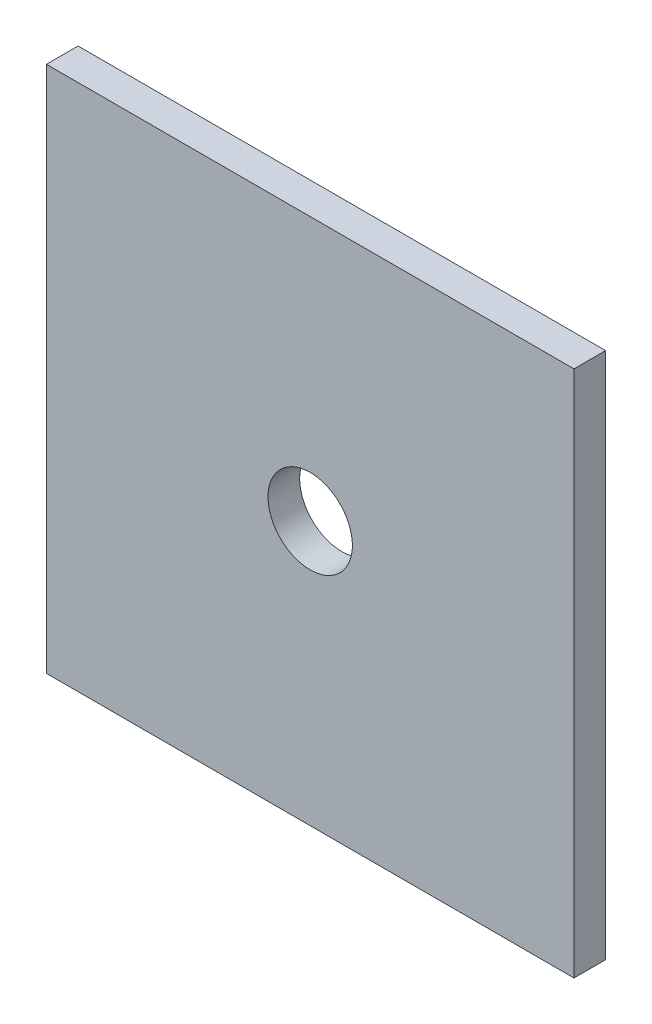
ISO-10303-21;
HEADER;
FILE_DESCRIPTION(('STEP AP214'),'2;1');
FILE_NAME('part.step','',(''),(''),'','','');
FILE_SCHEMA(('AUTOMOTIVE_DESIGN { 1 0 10303 214 1 1 1 1 }'));
ENDSEC;
DATA;
#1=APPLICATION_CONTEXT('core data for automotive mechanical design processes');
#2=APPLICATION_PROTOCOL_DEFINITION('international standard','automotive_design',2000,#1);
#3=PRODUCT_CONTEXT('',#1,'mechanical');
#4=PRODUCT('Part','Part','',(#3));
#5=PRODUCT_RELATED_PRODUCT_CATEGORY('part','',(#4));
#6=PRODUCT_DEFINITION_FORMATION('','',#4);
#7=PRODUCT_DEFINITION_CONTEXT('part definition',#1,'design');
#8=PRODUCT_DEFINITION('design','',#6,#7);
#9=PRODUCT_DEFINITION_SHAPE('','',#8);
#10=(LENGTH_UNIT() NAMED_UNIT(*) SI_UNIT(.MILLI.,.METRE.));
#11=(NAMED_UNIT(*) PLANE_ANGLE_UNIT() SI_UNIT($,.RADIAN.));
#12=(NAMED_UNIT(*) SI_UNIT($,.STERADIAN.) SOLID_ANGLE_UNIT());
#13=UNCERTAINTY_MEASURE_WITH_UNIT(LENGTH_MEASURE(1.E-05),#10,'distance_accuracy_value','');
#14=(GEOMETRIC_REPRESENTATION_CONTEXT(3) GLOBAL_UNCERTAINTY_ASSIGNED_CONTEXT((#13)) GLOBAL_UNIT_ASSIGNED_CONTEXT((#10,
#11,#12)) REPRESENTATION_CONTEXT('',''));
#15=CARTESIAN_POINT('',(0.,0.,0.));
#16=DIRECTION('',(0.,0.,1.));
#17=DIRECTION('',(1.,0.,0.));
#18=AXIS2_PLACEMENT_3D('',#15,#16,#17);
#19=CARTESIAN_POINT('',(0.,0.,0.));
#20=DIRECTION('',(0.,0.,-1.));
#21=DIRECTION('',(-1.,0.,0.));
#22=AXIS2_PLACEMENT_3D('',#19,#20,#21);
#23=PLANE('',#22);
#24=CARTESIAN_POINT('',(0.,0.,0.));
#25=DIRECTION('',(0.,0.,-1.));
#26=DIRECTION('',(-1.,0.,0.));
#27=AXIS2_PLACEMENT_3D('',#24,#25,#26);
#28=CIRCLE('',#27,4.);
#29=CARTESIAN_POINT('',(-4.,0.,0.));
#30=VERTEX_POINT('',#29);
#31=EDGE_CURVE('E20',#30,#30,#28,.F.);
#32=ORIENTED_EDGE('',*,*,#31,.T.);
#33=EDGE_LOOP('',(#32));
#34=FACE_BOUND('',#33,.T.);
#35=DIRECTION('',(0.,1.,0.));
#36=VECTOR('',#35,1.);
#37=CARTESIAN_POINT('',(-25.,-25.,0.));
#38=LINE('',#37,#36);
#39=CARTESIAN_POINT('',(-25.,-25.,0.));
#40=VERTEX_POINT('',#39);
#41=CARTESIAN_POINT('',(-25.,25.,0.));
#42=VERTEX_POINT('',#41);
#43=EDGE_CURVE('E55',#40,#42,#38,.T.);
#44=ORIENTED_EDGE('',*,*,#43,.T.);
#45=DIRECTION('',(1.,0.,0.));
#46=VECTOR('',#45,1.);
#47=CARTESIAN_POINT('',(-25.,25.,0.));
#48=LINE('',#47,#46);
#49=CARTESIAN_POINT('',(25.,25.,0.));
#50=VERTEX_POINT('',#49);
#51=EDGE_CURVE('E79',#42,#50,#48,.T.);
#52=ORIENTED_EDGE('',*,*,#51,.T.);
#53=DIRECTION('',(0.,1.,0.));
#54=VECTOR('',#53,1.);
#55=CARTESIAN_POINT('',(25.,-25.,0.));
#56=LINE('',#55,#54);
#57=CARTESIAN_POINT('',(25.,-25.,0.));
#58=VERTEX_POINT('',#57);
#59=EDGE_CURVE('E59',#50,#58,#56,.F.);
#60=ORIENTED_EDGE('',*,*,#59,.T.);
#61=DIRECTION('',(1.,0.,0.));
#62=VECTOR('',#61,1.);
#63=CARTESIAN_POINT('',(-25.,-25.,0.));
#64=LINE('',#63,#62);
#65=EDGE_CURVE('E58',#58,#40,#64,.F.);
#66=ORIENTED_EDGE('',*,*,#65,.T.);
#67=EDGE_LOOP('',(#44,#52,#60,#66));
#68=FACE_BOUND('',#67,.T.);
#69=ADVANCED_FACE('F17',(#34,#68),#23,.T.);
#70=CARTESIAN_POINT('',(-25.,-25.,3.));
#71=DIRECTION('',(0.,1.,0.));
#72=DIRECTION('',(0.,0.,1.));
#73=AXIS2_PLACEMENT_3D('',#70,#71,#72);
#74=PLANE('',#73);
#75=DIRECTION('',(0.,0.,1.));
#76=VECTOR('',#75,1.);
#77=CARTESIAN_POINT('',(25.,-25.,3.));
#78=LINE('',#77,#76);
#79=CARTESIAN_POINT('',(25.,-25.,3.));
#80=VERTEX_POINT('',#79);
#81=EDGE_CURVE('E81',#58,#80,#78,.T.);
#82=ORIENTED_EDGE('',*,*,#81,.T.);
#83=DIRECTION('',(-1.,0.,0.));
#84=VECTOR('',#83,1.);
#85=CARTESIAN_POINT('',(0.,-25.,3.));
#86=LINE('',#85,#84);
#87=CARTESIAN_POINT('',(-25.,-25.,3.));
#88=VERTEX_POINT('',#87);
#89=EDGE_CURVE('E75',#80,#88,#86,.T.);
#90=ORIENTED_EDGE('',*,*,#89,.T.);
#91=DIRECTION('',(0.,0.,-1.));
#92=VECTOR('',#91,1.);
#93=CARTESIAN_POINT('',(-25.,-25.,3.));
#94=LINE('',#93,#92);
#95=EDGE_CURVE('E64',#88,#40,#94,.T.);
#96=ORIENTED_EDGE('',*,*,#95,.T.);
#97=ORIENTED_EDGE('',*,*,#65,.F.);
#98=EDGE_LOOP('',(#82,#90,#96,#97));
#99=FACE_BOUND('',#98,.T.);
#100=ADVANCED_FACE('F74',(#99),#74,.F.);
#101=CARTESIAN_POINT('',(-25.,-25.,3.));
#102=DIRECTION('',(1.,0.,0.));
#103=DIRECTION('',(0.,0.,-1.));
#104=AXIS2_PLACEMENT_3D('',#101,#102,#103);
#105=PLANE('',#104);
#106=ORIENTED_EDGE('',*,*,#95,.F.);
#107=DIRECTION('',(0.,1.,0.));
#108=VECTOR('',#107,1.);
#109=CARTESIAN_POINT('',(-25.,0.,3.));
#110=LINE('',#109,#108);
#111=CARTESIAN_POINT('',(-25.,25.,3.));
#112=VERTEX_POINT('',#111);
#113=EDGE_CURVE('E86',#88,#112,#110,.T.);
#114=ORIENTED_EDGE('',*,*,#113,.T.);
#115=DIRECTION('',(0.,0.,-1.));
#116=VECTOR('',#115,1.);
#117=CARTESIAN_POINT('',(-25.,25.,3.));
#118=LINE('',#117,#116);
#119=EDGE_CURVE('E71',#112,#42,#118,.T.);
#120=ORIENTED_EDGE('',*,*,#119,.T.);
#121=ORIENTED_EDGE('',*,*,#43,.F.);
#122=EDGE_LOOP('',(#106,#114,#120,#121));
#123=FACE_BOUND('',#122,.T.);
#124=ADVANCED_FACE('F68',(#123),#105,.F.);
#125=CARTESIAN_POINT('',(-25.,25.,3.));
#126=DIRECTION('',(0.,-1.,0.));
#127=DIRECTION('',(0.,0.,-1.));
#128=AXIS2_PLACEMENT_3D('',#125,#126,#127);
#129=PLANE('',#128);
#130=ORIENTED_EDGE('',*,*,#119,.F.);
#131=DIRECTION('',(-1.,0.,0.));
#132=VECTOR('',#131,1.);
#133=CARTESIAN_POINT('',(0.,25.,3.));
#134=LINE('',#133,#132);
#135=CARTESIAN_POINT('',(25.,25.,3.));
#136=VERTEX_POINT('',#135);
#137=EDGE_CURVE('E88',#112,#136,#134,.F.);
#138=ORIENTED_EDGE('',*,*,#137,.T.);
#139=DIRECTION('',(0.,0.,1.));
#140=VECTOR('',#139,1.);
#141=CARTESIAN_POINT('',(25.,25.,3.));
#142=LINE('',#141,#140);
#143=EDGE_CURVE('E34',#136,#50,#142,.F.);
#144=ORIENTED_EDGE('',*,*,#143,.T.);
#145=ORIENTED_EDGE('',*,*,#51,.F.);
#146=EDGE_LOOP('',(#130,#138,#144,#145));
#147=FACE_BOUND('',#146,.T.);
#148=ADVANCED_FACE('F96',(#147),#129,.F.);
#149=CARTESIAN_POINT('',(25.,-25.,3.));
#150=DIRECTION('',(-1.,0.,0.));
#151=DIRECTION('',(0.,0.,1.));
#152=AXIS2_PLACEMENT_3D('',#149,#150,#151);
#153=PLANE('',#152);
#154=ORIENTED_EDGE('',*,*,#143,.F.);
#155=DIRECTION('',(0.,1.,0.));
#156=VECTOR('',#155,1.);
#157=CARTESIAN_POINT('',(25.,0.,3.));
#158=LINE('',#157,#156);
#159=EDGE_CURVE('E26',#136,#80,#158,.F.);
#160=ORIENTED_EDGE('',*,*,#159,.T.);
#161=ORIENTED_EDGE('',*,*,#81,.F.);
#162=ORIENTED_EDGE('',*,*,#59,.F.);
#163=EDGE_LOOP('',(#154,#160,#161,#162));
#164=FACE_BOUND('',#163,.T.);
#165=ADVANCED_FACE('F91',(#164),#153,.F.);
#166=CARTESIAN_POINT('',(0.,0.,3.));
#167=DIRECTION('',(0.,0.,-1.));
#168=DIRECTION('',(-1.,0.,0.));
#169=AXIS2_PLACEMENT_3D('',#166,#167,#168);
#170=CYLINDRICAL_SURFACE('',#169,4.);
#171=ORIENTED_EDGE('',*,*,#31,.F.);
#172=EDGE_LOOP('',(#171));
#173=FACE_BOUND('',#172,.T.);
#174=CARTESIAN_POINT('',(0.,0.,3.));
#175=DIRECTION('',(0.,0.,-1.));
#176=DIRECTION('',(-1.,0.,0.));
#177=AXIS2_PLACEMENT_3D('',#174,#175,#176);
#178=CIRCLE('',#177,4.);
#179=CARTESIAN_POINT('',(-4.,0.,3.));
#180=VERTEX_POINT('',#179);
#181=EDGE_CURVE('E11',#180,#180,#178,.F.);
#182=ORIENTED_EDGE('',*,*,#181,.T.);
#183=EDGE_LOOP('',(#182));
#184=FACE_BOUND('',#183,.T.);
#185=ADVANCED_FACE('F104',(#173,#184),#170,.F.);
#186=CARTESIAN_POINT('',(0.,0.,3.));
#187=DIRECTION('',(0.,0.,-1.));
#188=DIRECTION('',(-1.,0.,0.));
#189=AXIS2_PLACEMENT_3D('',#186,#187,#188);
#190=PLANE('',#189);
#191=ORIENTED_EDGE('',*,*,#181,.F.);
#192=EDGE_LOOP('',(#191));
#193=FACE_BOUND('',#192,.T.);
#194=ORIENTED_EDGE('',*,*,#137,.F.);
#195=ORIENTED_EDGE('',*,*,#113,.F.);
#196=ORIENTED_EDGE('',*,*,#89,.F.);
#197=ORIENTED_EDGE('',*,*,#159,.F.);
#198=EDGE_LOOP('',(#194,#195,#196,#197));
#199=FACE_BOUND('',#198,.T.);
#200=ADVANCED_FACE('F94',(#193,#199),#190,.F.);
#201=CLOSED_SHELL('',(#69,#100,#124,#148,#165,#185,#200));
#202=MANIFOLD_SOLID_BREP('B1',#201);
#203=ADVANCED_BREP_SHAPE_REPRESENTATION('',(#18,#202),#14);
#204=SHAPE_DEFINITION_REPRESENTATION(#9,#203);
ENDSEC;
END-ISO-10303-21;
